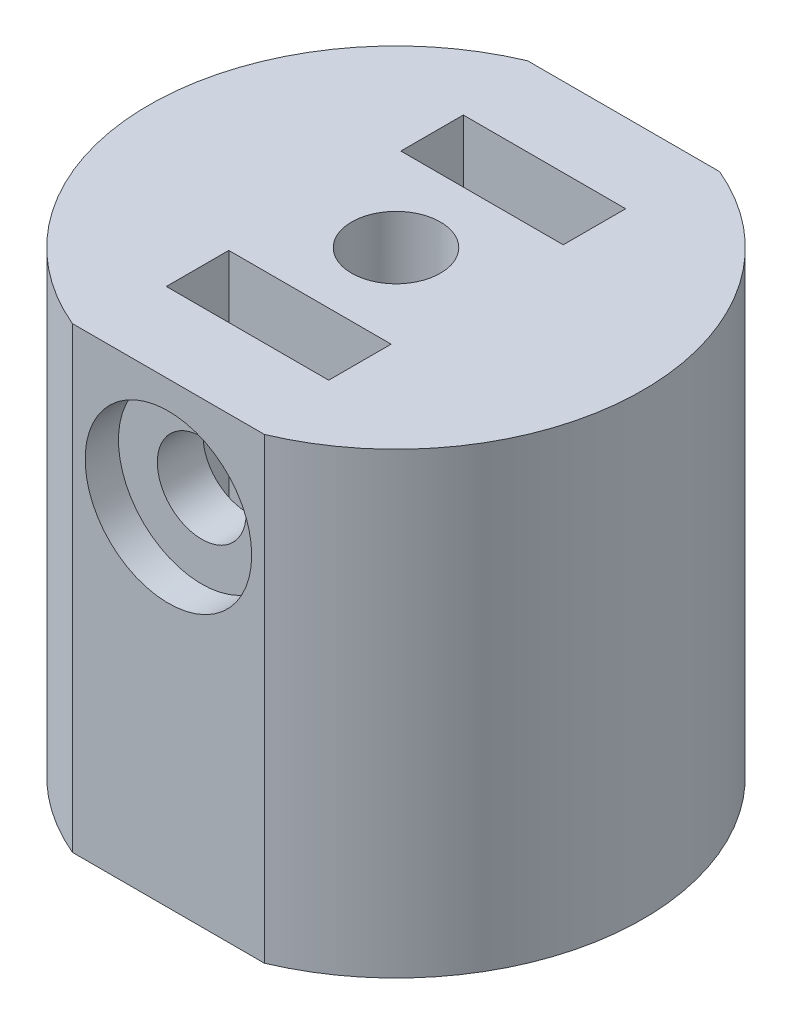
ISO-10303-21;
HEADER;
FILE_DESCRIPTION(('STEP AP214'),'2;1');
FILE_NAME('part.step','',(''),(''),'','','');
FILE_SCHEMA(('AUTOMOTIVE_DESIGN { 1 0 10303 214 1 1 1 1 }'));
ENDSEC;
DATA;
#1=APPLICATION_CONTEXT('core data for automotive mechanical design processes');
#2=APPLICATION_PROTOCOL_DEFINITION('international standard','automotive_design',2000,#1);
#3=PRODUCT_CONTEXT('',#1,'mechanical');
#4=PRODUCT('Part','Part','',(#3));
#5=PRODUCT_RELATED_PRODUCT_CATEGORY('part','',(#4));
#6=PRODUCT_DEFINITION_FORMATION('','',#4);
#7=PRODUCT_DEFINITION_CONTEXT('part definition',#1,'design');
#8=PRODUCT_DEFINITION('design','',#6,#7);
#9=PRODUCT_DEFINITION_SHAPE('','',#8);
#10=(LENGTH_UNIT() NAMED_UNIT(*) SI_UNIT(.MILLI.,.METRE.));
#11=(NAMED_UNIT(*) PLANE_ANGLE_UNIT() SI_UNIT($,.RADIAN.));
#12=(NAMED_UNIT(*) SI_UNIT($,.STERADIAN.) SOLID_ANGLE_UNIT());
#13=UNCERTAINTY_MEASURE_WITH_UNIT(LENGTH_MEASURE(1.E-05),#10,'distance_accuracy_value','');
#14=(GEOMETRIC_REPRESENTATION_CONTEXT(3) GLOBAL_UNCERTAINTY_ASSIGNED_CONTEXT((#13)) GLOBAL_UNIT_ASSIGNED_CONTEXT((#10,
#11,#12)) REPRESENTATION_CONTEXT('',''));
#15=CARTESIAN_POINT('',(0.,0.,0.));
#16=DIRECTION('',(0.,0.,1.));
#17=DIRECTION('',(1.,0.,0.));
#18=AXIS2_PLACEMENT_3D('',#15,#16,#17);
#19=CARTESIAN_POINT('',(0.,12.5,-8.2));
#20=DIRECTION('',(0.,0.,1.));
#21=DIRECTION('',(1.,0.,0.));
#22=AXIS2_PLACEMENT_3D('',#19,#20,#21);
#23=CYLINDRICAL_SURFACE('',#22,1.6);
#24=CARTESIAN_POINT('',(0.,12.5,-5.35));
#25=DIRECTION('',(0.,0.,1.));
#26=DIRECTION('',(1.,0.,0.));
#27=AXIS2_PLACEMENT_3D('',#24,#25,#26);
#28=CIRCLE('',#27,1.6);
#29=CARTESIAN_POINT('',(1.6,12.5,-5.35));
#30=VERTEX_POINT('',#29);
#31=EDGE_CURVE('E161',#30,#30,#28,.T.);
#32=ORIENTED_EDGE('',*,*,#31,.T.);
#33=EDGE_LOOP('',(#32));
#34=FACE_BOUND('',#33,.T.);
#35=CARTESIAN_POINT('',(0.,12.5,-7.));
#36=DIRECTION('',(0.,0.,-1.));
#37=DIRECTION('',(-1.,0.,0.));
#38=AXIS2_PLACEMENT_3D('',#35,#36,#37);
#39=CIRCLE('',#38,1.6);
#40=CARTESIAN_POINT('',(-1.6,12.5,-7.));
#41=VERTEX_POINT('',#40);
#42=EDGE_CURVE('E36',#41,#41,#39,.F.);
#43=ORIENTED_EDGE('',*,*,#42,.F.);
#44=EDGE_LOOP('',(#43));
#45=FACE_BOUND('',#44,.T.);
#46=ADVANCED_FACE('F32',(#34,#45),#23,.F.);
#47=CARTESIAN_POINT('',(0.,10.,0.));
#48=DIRECTION('',(0.,1.,0.));
#49=DIRECTION('',(0.,0.,1.));
#50=AXIS2_PLACEMENT_3D('',#47,#48,#49);
#51=CYLINDRICAL_SURFACE('',#50,1.6);
#52=CARTESIAN_POINT('',(0.,16.5,0.));
#53=DIRECTION('',(0.,1.,0.));
#54=DIRECTION('',(0.,0.,1.));
#55=AXIS2_PLACEMENT_3D('',#52,#53,#54);
#56=CIRCLE('',#55,1.6);
#57=CARTESIAN_POINT('',(0.,16.5,1.6));
#58=VERTEX_POINT('',#57);
#59=EDGE_CURVE('E207',#58,#58,#56,.T.);
#60=ORIENTED_EDGE('',*,*,#59,.T.);
#61=EDGE_LOOP('',(#60));
#62=FACE_BOUND('',#61,.T.);
#63=CARTESIAN_POINT('',(0.,12.5,0.));
#64=DIRECTION('',(0.,0.707106781186547,-0.707106781186548));
#65=DIRECTION('',(0.,0.707106781186547,0.707106781186548));
#66=AXIS2_PLACEMENT_3D('',#63,#64,#65);
#67=ELLIPSE('',#66,2.26274169979695,1.6);
#68=CARTESIAN_POINT('',(-1.6,12.5,0.));
#69=VERTEX_POINT('',#68);
#70=CARTESIAN_POINT('',(1.6,12.5,0.));
#71=VERTEX_POINT('',#70);
#72=EDGE_CURVE('E167',#69,#71,#67,.T.);
#73=ORIENTED_EDGE('',*,*,#72,.F.);
#74=CARTESIAN_POINT('',(0.,12.5,0.));
#75=DIRECTION('',(0.,0.707106781186547,0.707106781186548));
#76=DIRECTION('',(0.,0.707106781186547,-0.707106781186548));
#77=AXIS2_PLACEMENT_3D('',#74,#75,#76);
#78=ELLIPSE('',#77,2.26274169979695,1.6);
#79=EDGE_CURVE('E157',#69,#71,#78,.F.);
#80=ORIENTED_EDGE('',*,*,#79,.T.);
#81=EDGE_LOOP('',(#73,#80));
#82=FACE_BOUND('',#81,.T.);
#83=ADVANCED_FACE('F166',(#62,#82),#51,.F.);
#84=CARTESIAN_POINT('',(0.,16.5,0.));
#85=DIRECTION('',(0.,1.,0.));
#86=DIRECTION('',(0.,0.,1.));
#87=AXIS2_PLACEMENT_3D('',#84,#85,#86);
#88=PLANE('',#87);
#89=ORIENTED_EDGE('',*,*,#59,.F.);
#90=EDGE_LOOP('',(#89));
#91=FACE_BOUND('',#90,.T.);
#92=DIRECTION('',(0.,0.,1.));
#93=VECTOR('',#92,1.);
#94=CARTESIAN_POINT('',(-2.925,16.5,3.1));
#95=LINE('',#94,#93);
#96=CARTESIAN_POINT('',(-2.925,16.5,3.1));
#97=VERTEX_POINT('',#96);
#98=CARTESIAN_POINT('',(-2.925,16.5,5.35));
#99=VERTEX_POINT('',#98);
#100=EDGE_CURVE('E172',#97,#99,#95,.T.);
#101=ORIENTED_EDGE('',*,*,#100,.F.);
#102=DIRECTION('',(-1.,0.,0.));
#103=VECTOR('',#102,1.);
#104=CARTESIAN_POINT('',(-2.925,16.5,3.1));
#105=LINE('',#104,#103);
#106=CARTESIAN_POINT('',(2.925,16.5,3.1));
#107=VERTEX_POINT('',#106);
#108=EDGE_CURVE('E186',#107,#97,#105,.T.);
#109=ORIENTED_EDGE('',*,*,#108,.F.);
#110=DIRECTION('',(0.,0.,-1.));
#111=VECTOR('',#110,1.);
#112=CARTESIAN_POINT('',(2.925,16.5,3.1));
#113=LINE('',#112,#111);
#114=CARTESIAN_POINT('',(2.925,16.5,5.35));
#115=VERTEX_POINT('',#114);
#116=EDGE_CURVE('E200',#115,#107,#113,.T.);
#117=ORIENTED_EDGE('',*,*,#116,.F.);
#118=DIRECTION('',(1.,0.,0.));
#119=VECTOR('',#118,1.);
#120=CARTESIAN_POINT('',(-2.925,16.5,5.35));
#121=LINE('',#120,#119);
#122=EDGE_CURVE('E197',#99,#115,#121,.T.);
#123=ORIENTED_EDGE('',*,*,#122,.F.);
#124=EDGE_LOOP('',(#101,#109,#117,#123));
#125=FACE_BOUND('',#124,.T.);
#126=DIRECTION('',(-1.,0.,0.));
#127=VECTOR('',#126,1.);
#128=CARTESIAN_POINT('',(3.45976877840124,16.5,-8.2));
#129=LINE('',#128,#127);
#130=CARTESIAN_POINT('',(3.45976877840124,16.5,-8.2));
#131=VERTEX_POINT('',#130);
#132=CARTESIAN_POINT('',(-3.45976877840124,16.5,-8.2));
#133=VERTEX_POINT('',#132);
#134=EDGE_CURVE('E311',#131,#133,#129,.T.);
#135=ORIENTED_EDGE('',*,*,#134,.T.);
#136=CARTESIAN_POINT('',(0.,16.5,0.));
#137=DIRECTION('',(0.,1.,0.));
#138=DIRECTION('',(0.,0.,1.));
#139=AXIS2_PLACEMENT_3D('',#136,#137,#138);
#140=CIRCLE('',#139,8.9);
#141=CARTESIAN_POINT('',(-3.45976877840124,16.5,8.2));
#142=VERTEX_POINT('',#141);
#143=EDGE_CURVE('E256',#133,#142,#140,.T.);
#144=ORIENTED_EDGE('',*,*,#143,.T.);
#145=DIRECTION('',(1.,0.,0.));
#146=VECTOR('',#145,1.);
#147=CARTESIAN_POINT('',(-3.45976877840124,16.5,8.2));
#148=LINE('',#147,#146);
#149=CARTESIAN_POINT('',(3.45976877840124,16.5,8.2));
#150=VERTEX_POINT('',#149);
#151=EDGE_CURVE('E323',#142,#150,#148,.T.);
#152=ORIENTED_EDGE('',*,*,#151,.T.);
#153=CARTESIAN_POINT('',(0.,16.5,0.));
#154=DIRECTION('',(0.,1.,0.));
#155=DIRECTION('',(0.,0.,1.));
#156=AXIS2_PLACEMENT_3D('',#153,#154,#155);
#157=CIRCLE('',#156,8.9);
#158=EDGE_CURVE('E57',#150,#131,#157,.T.);
#159=ORIENTED_EDGE('',*,*,#158,.T.);
#160=EDGE_LOOP('',(#135,#144,#152,#159));
#161=FACE_BOUND('',#160,.T.);
#162=DIRECTION('',(-1.,0.,0.));
#163=VECTOR('',#162,1.);
#164=CARTESIAN_POINT('',(-2.925,16.5,-3.1));
#165=LINE('',#164,#163);
#166=CARTESIAN_POINT('',(2.925,16.5,-3.1));
#167=VERTEX_POINT('',#166);
#168=CARTESIAN_POINT('',(-2.925,16.5,-3.1));
#169=VERTEX_POINT('',#168);
#170=EDGE_CURVE('E288',#167,#169,#165,.T.);
#171=ORIENTED_EDGE('',*,*,#170,.T.);
#172=DIRECTION('',(0.,0.,-1.));
#173=VECTOR('',#172,1.);
#174=CARTESIAN_POINT('',(-2.925,16.5,-3.1));
#175=LINE('',#174,#173);
#176=CARTESIAN_POINT('',(-2.925,16.5,-5.35));
#177=VERTEX_POINT('',#176);
#178=EDGE_CURVE('E49',#169,#177,#175,.T.);
#179=ORIENTED_EDGE('',*,*,#178,.T.);
#180=DIRECTION('',(1.,0.,0.));
#181=VECTOR('',#180,1.);
#182=CARTESIAN_POINT('',(-2.925,16.5,-5.35));
#183=LINE('',#182,#181);
#184=CARTESIAN_POINT('',(2.925,16.5,-5.35));
#185=VERTEX_POINT('',#184);
#186=EDGE_CURVE('E280',#177,#185,#183,.T.);
#187=ORIENTED_EDGE('',*,*,#186,.T.);
#188=DIRECTION('',(0.,0.,1.));
#189=VECTOR('',#188,1.);
#190=CARTESIAN_POINT('',(2.925,16.5,-3.1));
#191=LINE('',#190,#189);
#192=EDGE_CURVE('E291',#185,#167,#191,.T.);
#193=ORIENTED_EDGE('',*,*,#192,.T.);
#194=EDGE_LOOP('',(#171,#179,#187,#193));
#195=FACE_BOUND('',#194,.T.);
#196=ADVANCED_FACE('F343',(#91,#125,#161,#195),#88,.T.);
#197=CARTESIAN_POINT('',(0.,12.5,11.3));
#198=DIRECTION('',(0.,0.,-1.));
#199=DIRECTION('',(-1.,0.,0.));
#200=AXIS2_PLACEMENT_3D('',#197,#198,#199);
#201=CYLINDRICAL_SURFACE('',#200,1.6);
#202=CARTESIAN_POINT('',(0.,12.5,5.35));
#203=DIRECTION('',(0.,0.,1.));
#204=DIRECTION('',(1.,0.,0.));
#205=AXIS2_PLACEMENT_3D('',#202,#203,#204);
#206=CIRCLE('',#205,1.6);
#207=CARTESIAN_POINT('',(1.6,12.5,5.35));
#208=VERTEX_POINT('',#207);
#209=EDGE_CURVE('E178',#208,#208,#206,.F.);
#210=ORIENTED_EDGE('',*,*,#209,.T.);
#211=EDGE_LOOP('',(#210));
#212=FACE_BOUND('',#211,.T.);
#213=CARTESIAN_POINT('',(0.,12.5,7.));
#214=DIRECTION('',(0.,0.,1.));
#215=DIRECTION('',(1.,0.,0.));
#216=AXIS2_PLACEMENT_3D('',#213,#214,#215);
#217=CIRCLE('',#216,1.6);
#218=CARTESIAN_POINT('',(1.6,12.5,7.));
#219=VERTEX_POINT('',#218);
#220=EDGE_CURVE('E254',#219,#219,#217,.T.);
#221=ORIENTED_EDGE('',*,*,#220,.T.);
#222=EDGE_LOOP('',(#221));
#223=FACE_BOUND('',#222,.T.);
#224=ADVANCED_FACE('F481',(#212,#223),#201,.F.);
#225=CARTESIAN_POINT('',(0.,0.,0.));
#226=DIRECTION('',(0.,1.,0.));
#227=DIRECTION('',(0.,0.,1.));
#228=AXIS2_PLACEMENT_3D('',#225,#226,#227);
#229=PLANE('',#228);
#230=CARTESIAN_POINT('',(0.,0.,0.));
#231=DIRECTION('',(0.,-1.,0.));
#232=DIRECTION('',(0.,0.,-1.));
#233=AXIS2_PLACEMENT_3D('',#230,#231,#232);
#234=CIRCLE('',#233,4.7);
#235=CARTESIAN_POINT('',(0.,0.,-4.7));
#236=VERTEX_POINT('',#235);
#237=EDGE_CURVE('E41',#236,#236,#234,.T.);
#238=ORIENTED_EDGE('',*,*,#237,.F.);
#239=EDGE_LOOP('',(#238));
#240=FACE_BOUND('',#239,.T.);
#241=CARTESIAN_POINT('',(0.,0.,0.));
#242=DIRECTION('',(0.,1.,0.));
#243=DIRECTION('',(0.,0.,1.));
#244=AXIS2_PLACEMENT_3D('',#241,#242,#243);
#245=CIRCLE('',#244,8.9);
#246=CARTESIAN_POINT('',(-3.45976877840124,0.,-8.2));
#247=VERTEX_POINT('',#246);
#248=CARTESIAN_POINT('',(-3.45976877840124,0.,8.2));
#249=VERTEX_POINT('',#248);
#250=EDGE_CURVE('E308',#247,#249,#245,.T.);
#251=ORIENTED_EDGE('',*,*,#250,.F.);
#252=DIRECTION('',(-1.,0.,0.));
#253=VECTOR('',#252,1.);
#254=CARTESIAN_POINT('',(3.45976877840124,0.,-8.2));
#255=LINE('',#254,#253);
#256=CARTESIAN_POINT('',(3.45976877840124,0.,-8.2));
#257=VERTEX_POINT('',#256);
#258=EDGE_CURVE('E317',#257,#247,#255,.T.);
#259=ORIENTED_EDGE('',*,*,#258,.F.);
#260=CARTESIAN_POINT('',(0.,0.,0.));
#261=DIRECTION('',(0.,1.,0.));
#262=DIRECTION('',(0.,0.,1.));
#263=AXIS2_PLACEMENT_3D('',#260,#261,#262);
#264=CIRCLE('',#263,8.9);
#265=CARTESIAN_POINT('',(3.45976877840124,0.,8.2));
#266=VERTEX_POINT('',#265);
#267=EDGE_CURVE('E314',#266,#257,#264,.T.);
#268=ORIENTED_EDGE('',*,*,#267,.F.);
#269=DIRECTION('',(1.,0.,0.));
#270=VECTOR('',#269,1.);
#271=CARTESIAN_POINT('',(-3.45976877840124,0.,8.2));
#272=LINE('',#271,#270);
#273=EDGE_CURVE('E310',#249,#266,#272,.T.);
#274=ORIENTED_EDGE('',*,*,#273,.F.);
#275=EDGE_LOOP('',(#251,#259,#268,#274));
#276=FACE_BOUND('',#275,.T.);
#277=ADVANCED_FACE('F34',(#240,#276),#229,.F.);
#278=CARTESIAN_POINT('',(0.,10.5,0.));
#279=DIRECTION('',(0.,-1.,0.));
#280=DIRECTION('',(0.,0.,-1.));
#281=AXIS2_PLACEMENT_3D('',#278,#279,#280);
#282=CIRCLE('',#281,1.6);
#283=CARTESIAN_POINT('',(0.,10.5,-1.6));
#284=VERTEX_POINT('',#283);
#285=EDGE_CURVE('E216',#284,#284,#282,.T.);
#286=ORIENTED_EDGE('',*,*,#285,.T.);
#287=EDGE_LOOP('',(#286));
#288=FACE_BOUND('',#287,.T.);
#289=CARTESIAN_POINT('',(0.,12.5,0.));
#290=DIRECTION('',(0.,0.707106781186547,0.707106781186548));
#291=DIRECTION('',(0.,0.707106781186547,-0.707106781186548));
#292=AXIS2_PLACEMENT_3D('',#289,#290,#291);
#293=ELLIPSE('',#292,2.26274169979695,1.6);
#294=EDGE_CURVE('E171',#71,#69,#293,.F.);
#295=ORIENTED_EDGE('',*,*,#294,.F.);
#296=CARTESIAN_POINT('',(0.,12.5,0.));
#297=DIRECTION('',(0.,0.707106781186547,-0.707106781186548));
#298=DIRECTION('',(0.,0.707106781186547,0.707106781186548));
#299=AXIS2_PLACEMENT_3D('',#296,#297,#298);
#300=ELLIPSE('',#299,2.26274169979695,1.6);
#301=EDGE_CURVE('E154',#71,#69,#300,.T.);
#302=ORIENTED_EDGE('',*,*,#301,.T.);
#303=EDGE_LOOP('',(#295,#302));
#304=FACE_BOUND('',#303,.T.);
#305=ADVANCED_FACE('F174',(#288,#304),#51,.F.);
#306=CARTESIAN_POINT('',(0.,4.5,0.));
#307=DIRECTION('',(0.,-1.,0.));
#308=DIRECTION('',(0.,0.,-1.));
#309=AXIS2_PLACEMENT_3D('',#306,#307,#308);
#310=PLANE('',#309);
#311=CARTESIAN_POINT('',(0.,4.5,0.));
#312=DIRECTION('',(0.,-1.,0.));
#313=DIRECTION('',(0.,0.,-1.));
#314=AXIS2_PLACEMENT_3D('',#311,#312,#313);
#315=CIRCLE('',#314,2.6);
#316=CARTESIAN_POINT('',(2.00935312974101,4.5,1.65));
#317=VERTEX_POINT('',#316);
#318=CARTESIAN_POINT('',(-2.00935312974101,4.5,1.65));
#319=VERTEX_POINT('',#318);
#320=EDGE_CURVE('E244',#317,#319,#315,.T.);
#321=ORIENTED_EDGE('',*,*,#320,.T.);
#322=DIRECTION('',(1.,0.,0.));
#323=VECTOR('',#322,1.);
#324=CARTESIAN_POINT('',(0.,4.5,1.65));
#325=LINE('',#324,#323);
#326=EDGE_CURVE('E221',#319,#317,#325,.T.);
#327=ORIENTED_EDGE('',*,*,#326,.T.);
#328=EDGE_LOOP('',(#321,#327));
#329=FACE_BOUND('',#328,.T.);
#330=ADVANCED_FACE('F491',(#329),#310,.T.);
#331=CARTESIAN_POINT('',(0.,1.5,0.));
#332=DIRECTION('',(0.,-1.,0.));
#333=DIRECTION('',(0.,0.,-1.));
#334=AXIS2_PLACEMENT_3D('',#331,#332,#333);
#335=CYLINDRICAL_SURFACE('',#334,4.7);
#336=CARTESIAN_POINT('',(0.,1.5,0.));
#337=DIRECTION('',(0.,-1.,0.));
#338=DIRECTION('',(0.,0.,-1.));
#339=AXIS2_PLACEMENT_3D('',#336,#337,#338);
#340=CIRCLE('',#339,4.7);
#341=CARTESIAN_POINT('',(0.,1.5,-4.7));
#342=VERTEX_POINT('',#341);
#343=EDGE_CURVE('E11',#342,#342,#340,.T.);
#344=ORIENTED_EDGE('',*,*,#343,.F.);
#345=EDGE_LOOP('',(#344));
#346=FACE_BOUND('',#345,.T.);
#347=ORIENTED_EDGE('',*,*,#237,.T.);
#348=EDGE_LOOP('',(#347));
#349=FACE_BOUND('',#348,.T.);
#350=ADVANCED_FACE('F545',(#346,#349),#335,.F.);
#351=CARTESIAN_POINT('',(0.,1.5,0.));
#352=DIRECTION('',(0.,-1.,0.));
#353=DIRECTION('',(0.,0.,-1.));
#354=AXIS2_PLACEMENT_3D('',#351,#352,#353);
#355=PLANE('',#354);
#356=CARTESIAN_POINT('',(0.,1.5,0.));
#357=DIRECTION('',(0.,-1.,0.));
#358=DIRECTION('',(0.,0.,-1.));
#359=AXIS2_PLACEMENT_3D('',#356,#357,#358);
#360=CIRCLE('',#359,2.6);
#361=CARTESIAN_POINT('',(0.,1.5,-2.6));
#362=VERTEX_POINT('',#361);
#363=EDGE_CURVE('E235',#362,#362,#360,.T.);
#364=ORIENTED_EDGE('',*,*,#363,.F.);
#365=EDGE_LOOP('',(#364));
#366=FACE_BOUND('',#365,.T.);
#367=ORIENTED_EDGE('',*,*,#343,.T.);
#368=EDGE_LOOP('',(#367));
#369=FACE_BOUND('',#368,.T.);
#370=ADVANCED_FACE('F547',(#366,#369),#355,.T.);
#371=CARTESIAN_POINT('',(0.,4.5,0.));
#372=DIRECTION('',(0.,-1.,0.));
#373=DIRECTION('',(0.,0.,-1.));
#374=AXIS2_PLACEMENT_3D('',#371,#372,#373);
#375=CYLINDRICAL_SURFACE('',#374,2.6);
#376=ORIENTED_EDGE('',*,*,#320,.F.);
#377=DIRECTION('',(0.,-1.,0.));
#378=VECTOR('',#377,1.);
#379=CARTESIAN_POINT('',(2.00935312974101,10.5,1.65));
#380=LINE('',#379,#378);
#381=CARTESIAN_POINT('',(2.00935312974101,10.5,1.65));
#382=VERTEX_POINT('',#381);
#383=EDGE_CURVE('E236',#382,#317,#380,.T.);
#384=ORIENTED_EDGE('',*,*,#383,.F.);
#385=CARTESIAN_POINT('',(0.,10.5,0.));
#386=DIRECTION('',(0.,-1.,0.));
#387=DIRECTION('',(0.,0.,-1.));
#388=AXIS2_PLACEMENT_3D('',#385,#386,#387);
#389=CIRCLE('',#388,2.6);
#390=CARTESIAN_POINT('',(2.00935312974101,10.5,-1.65));
#391=VERTEX_POINT('',#390);
#392=EDGE_CURVE('E222',#391,#382,#389,.T.);
#393=ORIENTED_EDGE('',*,*,#392,.F.);
#394=DIRECTION('',(0.,-1.,0.));
#395=VECTOR('',#394,1.);
#396=CARTESIAN_POINT('',(2.00935312974101,10.5,-1.65));
#397=LINE('',#396,#395);
#398=CARTESIAN_POINT('',(2.00935312974101,4.5,-1.65));
#399=VERTEX_POINT('',#398);
#400=EDGE_CURVE('E238',#391,#399,#397,.T.);
#401=ORIENTED_EDGE('',*,*,#400,.T.);
#402=CARTESIAN_POINT('',(-2.00935312974101,4.5,-1.65));
#403=VERTEX_POINT('',#402);
#404=EDGE_CURVE('E241',#403,#399,#315,.T.);
#405=ORIENTED_EDGE('',*,*,#404,.F.);
#406=DIRECTION('',(0.,-1.,0.));
#407=VECTOR('',#406,1.);
#408=CARTESIAN_POINT('',(-2.00935312974101,10.5,-1.65));
#409=LINE('',#408,#407);
#410=CARTESIAN_POINT('',(-2.00935312974101,10.5,-1.65));
#411=VERTEX_POINT('',#410);
#412=EDGE_CURVE('E227',#411,#403,#409,.T.);
#413=ORIENTED_EDGE('',*,*,#412,.F.);
#414=CARTESIAN_POINT('',(-2.00935312974101,10.5,1.65));
#415=VERTEX_POINT('',#414);
#416=EDGE_CURVE('E217',#415,#411,#389,.T.);
#417=ORIENTED_EDGE('',*,*,#416,.F.);
#418=DIRECTION('',(0.,-1.,0.));
#419=VECTOR('',#418,1.);
#420=CARTESIAN_POINT('',(-2.00935312974101,10.5,1.65));
#421=LINE('',#420,#419);
#422=EDGE_CURVE('E233',#415,#319,#421,.T.);
#423=ORIENTED_EDGE('',*,*,#422,.T.);
#424=EDGE_LOOP('',(#376,#384,#393,#401,#405,#413,#417,#423));
#425=FACE_BOUND('',#424,.T.);
#426=ORIENTED_EDGE('',*,*,#363,.T.);
#427=EDGE_LOOP('',(#426));
#428=FACE_BOUND('',#427,.T.);
#429=ADVANCED_FACE('F553',(#425,#428),#375,.F.);
#430=DIRECTION('',(1.,0.,0.));
#431=VECTOR('',#430,1.);
#432=CARTESIAN_POINT('',(0.,4.5,-1.65));
#433=LINE('',#432,#431);
#434=EDGE_CURVE('E228',#403,#399,#433,.T.);
#435=ORIENTED_EDGE('',*,*,#434,.F.);
#436=ORIENTED_EDGE('',*,*,#404,.T.);
#437=EDGE_LOOP('',(#435,#436));
#438=FACE_BOUND('',#437,.T.);
#439=ADVANCED_FACE('F558',(#438),#310,.T.);
#440=CARTESIAN_POINT('',(0.,10.5,1.65));
#441=DIRECTION('',(0.,0.,-1.));
#442=DIRECTION('',(-1.,0.,0.));
#443=AXIS2_PLACEMENT_3D('',#440,#441,#442);
#444=PLANE('',#443);
#445=ORIENTED_EDGE('',*,*,#326,.F.);
#446=ORIENTED_EDGE('',*,*,#422,.F.);
#447=DIRECTION('',(1.,0.,0.));
#448=VECTOR('',#447,1.);
#449=CARTESIAN_POINT('',(0.,10.5,1.65));
#450=LINE('',#449,#448);
#451=EDGE_CURVE('E225',#415,#382,#450,.T.);
#452=ORIENTED_EDGE('',*,*,#451,.T.);
#453=ORIENTED_EDGE('',*,*,#383,.T.);
#454=EDGE_LOOP('',(#445,#446,#452,#453));
#455=FACE_BOUND('',#454,.T.);
#456=ADVANCED_FACE('F565',(#455),#444,.T.);
#457=CARTESIAN_POINT('',(0.,10.5,-1.65));
#458=DIRECTION('',(0.,0.,-1.));
#459=DIRECTION('',(-1.,0.,0.));
#460=AXIS2_PLACEMENT_3D('',#457,#458,#459);
#461=PLANE('',#460);
#462=ORIENTED_EDGE('',*,*,#434,.T.);
#463=ORIENTED_EDGE('',*,*,#400,.F.);
#464=DIRECTION('',(1.,0.,0.));
#465=VECTOR('',#464,1.);
#466=CARTESIAN_POINT('',(0.,10.5,-1.65));
#467=LINE('',#466,#465);
#468=EDGE_CURVE('E220',#411,#391,#467,.T.);
#469=ORIENTED_EDGE('',*,*,#468,.F.);
#470=ORIENTED_EDGE('',*,*,#412,.T.);
#471=EDGE_LOOP('',(#462,#463,#469,#470));
#472=FACE_BOUND('',#471,.T.);
#473=ADVANCED_FACE('F567',(#472),#461,.F.);
#474=CARTESIAN_POINT('',(0.,10.5,0.));
#475=DIRECTION('',(0.,-1.,0.));
#476=DIRECTION('',(0.,0.,-1.));
#477=AXIS2_PLACEMENT_3D('',#474,#475,#476);
#478=PLANE('',#477);
#479=ORIENTED_EDGE('',*,*,#285,.F.);
#480=EDGE_LOOP('',(#479));
#481=FACE_BOUND('',#480,.T.);
#482=ORIENTED_EDGE('',*,*,#416,.T.);
#483=ORIENTED_EDGE('',*,*,#468,.T.);
#484=ORIENTED_EDGE('',*,*,#392,.T.);
#485=ORIENTED_EDGE('',*,*,#451,.F.);
#486=EDGE_LOOP('',(#482,#483,#484,#485));
#487=FACE_BOUND('',#486,.T.);
#488=ADVANCED_FACE('F570',(#481,#487),#478,.T.);
#489=CARTESIAN_POINT('',(-2.925,8.5,3.1));
#490=DIRECTION('',(-1.,0.,0.));
#491=DIRECTION('',(0.,0.,1.));
#492=AXIS2_PLACEMENT_3D('',#489,#490,#491);
#493=PLANE('',#492);
#494=ORIENTED_EDGE('',*,*,#100,.T.);
#495=DIRECTION('',(0.,1.,0.));
#496=VECTOR('',#495,1.);
#497=CARTESIAN_POINT('',(-2.925,8.5,5.35));
#498=LINE('',#497,#496);
#499=CARTESIAN_POINT('',(-2.925,8.5,5.35));
#500=VERTEX_POINT('',#499);
#501=EDGE_CURVE('E195',#500,#99,#498,.T.);
#502=ORIENTED_EDGE('',*,*,#501,.F.);
#503=DIRECTION('',(0.,0.,1.));
#504=VECTOR('',#503,1.);
#505=CARTESIAN_POINT('',(-2.925,8.5,3.1));
#506=LINE('',#505,#504);
#507=CARTESIAN_POINT('',(-2.925,8.5,3.1));
#508=VERTEX_POINT('',#507);
#509=EDGE_CURVE('E182',#508,#500,#506,.T.);
#510=ORIENTED_EDGE('',*,*,#509,.F.);
#511=DIRECTION('',(0.,1.,0.));
#512=VECTOR('',#511,1.);
#513=CARTESIAN_POINT('',(-2.925,8.5,3.1));
#514=LINE('',#513,#512);
#515=EDGE_CURVE('E205',#508,#97,#514,.T.);
#516=ORIENTED_EDGE('',*,*,#515,.T.);
#517=EDGE_LOOP('',(#494,#502,#510,#516));
#518=FACE_BOUND('',#517,.T.);
#519=ADVANCED_FACE('F576',(#518),#493,.F.);
#520=CARTESIAN_POINT('',(-2.925,8.5,3.1));
#521=DIRECTION('',(0.,0.,-1.));
#522=DIRECTION('',(-1.,0.,0.));
#523=AXIS2_PLACEMENT_3D('',#520,#521,#522);
#524=PLANE('',#523);
#525=CARTESIAN_POINT('',(0.,12.5,3.1));
#526=DIRECTION('',(0.,0.,-1.));
#527=DIRECTION('',(-1.,0.,0.));
#528=AXIS2_PLACEMENT_3D('',#525,#526,#527);
#529=CIRCLE('',#528,1.6);
#530=CARTESIAN_POINT('',(-1.6,12.5,3.1));
#531=VERTEX_POINT('',#530);
#532=EDGE_CURVE('E175',#531,#531,#529,.F.);
#533=ORIENTED_EDGE('',*,*,#532,.F.);
#534=EDGE_LOOP('',(#533));
#535=FACE_BOUND('',#534,.T.);
#536=ORIENTED_EDGE('',*,*,#108,.T.);
#537=ORIENTED_EDGE('',*,*,#515,.F.);
#538=DIRECTION('',(-1.,0.,0.));
#539=VECTOR('',#538,1.);
#540=CARTESIAN_POINT('',(-2.925,8.5,3.1));
#541=LINE('',#540,#539);
#542=CARTESIAN_POINT('',(2.925,8.5,3.1));
#543=VERTEX_POINT('',#542);
#544=EDGE_CURVE('E192',#543,#508,#541,.T.);
#545=ORIENTED_EDGE('',*,*,#544,.F.);
#546=DIRECTION('',(0.,1.,0.));
#547=VECTOR('',#546,1.);
#548=CARTESIAN_POINT('',(2.925,8.5,3.1));
#549=LINE('',#548,#547);
#550=EDGE_CURVE('E208',#543,#107,#549,.T.);
#551=ORIENTED_EDGE('',*,*,#550,.T.);
#552=EDGE_LOOP('',(#536,#537,#545,#551));
#553=FACE_BOUND('',#552,.T.);
#554=ADVANCED_FACE('F581',(#535,#553),#524,.F.);
#555=CARTESIAN_POINT('',(2.925,8.5,3.1));
#556=DIRECTION('',(1.,0.,0.));
#557=DIRECTION('',(0.,0.,-1.));
#558=AXIS2_PLACEMENT_3D('',#555,#556,#557);
#559=PLANE('',#558);
#560=ORIENTED_EDGE('',*,*,#116,.T.);
#561=ORIENTED_EDGE('',*,*,#550,.F.);
#562=DIRECTION('',(0.,0.,-1.));
#563=VECTOR('',#562,1.);
#564=CARTESIAN_POINT('',(2.925,8.5,3.1));
#565=LINE('',#564,#563);
#566=CARTESIAN_POINT('',(2.925,8.5,5.35));
#567=VERTEX_POINT('',#566);
#568=EDGE_CURVE('E189',#567,#543,#565,.T.);
#569=ORIENTED_EDGE('',*,*,#568,.F.);
#570=DIRECTION('',(0.,1.,0.));
#571=VECTOR('',#570,1.);
#572=CARTESIAN_POINT('',(2.925,8.5,5.35));
#573=LINE('',#572,#571);
#574=EDGE_CURVE('E210',#567,#115,#573,.T.);
#575=ORIENTED_EDGE('',*,*,#574,.T.);
#576=EDGE_LOOP('',(#560,#561,#569,#575));
#577=FACE_BOUND('',#576,.T.);
#578=ADVANCED_FACE('F586',(#577),#559,.F.);
#579=CARTESIAN_POINT('',(-2.925,8.5,5.35));
#580=DIRECTION('',(0.,0.,1.));
#581=DIRECTION('',(1.,0.,0.));
#582=AXIS2_PLACEMENT_3D('',#579,#580,#581);
#583=PLANE('',#582);
#584=ORIENTED_EDGE('',*,*,#209,.F.);
#585=EDGE_LOOP('',(#584));
#586=FACE_BOUND('',#585,.T.);
#587=ORIENTED_EDGE('',*,*,#122,.T.);
#588=ORIENTED_EDGE('',*,*,#574,.F.);
#589=DIRECTION('',(1.,0.,0.));
#590=VECTOR('',#589,1.);
#591=CARTESIAN_POINT('',(-2.925,8.5,5.35));
#592=LINE('',#591,#590);
#593=EDGE_CURVE('E185',#500,#567,#592,.T.);
#594=ORIENTED_EDGE('',*,*,#593,.F.);
#595=ORIENTED_EDGE('',*,*,#501,.T.);
#596=EDGE_LOOP('',(#587,#588,#594,#595));
#597=FACE_BOUND('',#596,.T.);
#598=ADVANCED_FACE('F583',(#586,#597),#583,.F.);
#599=CARTESIAN_POINT('',(0.,8.5,0.));
#600=DIRECTION('',(0.,1.,0.));
#601=DIRECTION('',(0.,0.,1.));
#602=AXIS2_PLACEMENT_3D('',#599,#600,#601);
#603=PLANE('',#602);
#604=ORIENTED_EDGE('',*,*,#509,.T.);
#605=ORIENTED_EDGE('',*,*,#593,.T.);
#606=ORIENTED_EDGE('',*,*,#568,.T.);
#607=ORIENTED_EDGE('',*,*,#544,.T.);
#608=EDGE_LOOP('',(#604,#605,#606,#607));
#609=FACE_BOUND('',#608,.T.);
#610=ADVANCED_FACE('F502',(#609),#603,.T.);
#611=ORIENTED_EDGE('',*,*,#532,.T.);
#612=EDGE_LOOP('',(#611));
#613=FACE_BOUND('',#612,.T.);
#614=ORIENTED_EDGE('',*,*,#72,.T.);
#615=ORIENTED_EDGE('',*,*,#294,.T.);
#616=EDGE_LOOP('',(#614,#615));
#617=FACE_BOUND('',#616,.T.);
#618=ADVANCED_FACE('F170',(#613,#617),#201,.F.);
#619=CARTESIAN_POINT('',(0.,0.,0.));
#620=DIRECTION('',(0.,1.,0.));
#621=DIRECTION('',(0.,0.,1.));
#622=AXIS2_PLACEMENT_3D('',#619,#620,#621);
#623=CYLINDRICAL_SURFACE('',#622,8.9);
#624=ORIENTED_EDGE('',*,*,#143,.F.);
#625=DIRECTION('',(0.,1.,0.));
#626=VECTOR('',#625,1.);
#627=CARTESIAN_POINT('',(-3.45976877840124,0.,-8.2));
#628=LINE('',#627,#626);
#629=EDGE_CURVE('E253',#247,#133,#628,.T.);
#630=ORIENTED_EDGE('',*,*,#629,.F.);
#631=ORIENTED_EDGE('',*,*,#250,.T.);
#632=DIRECTION('',(0.,1.,0.));
#633=VECTOR('',#632,1.);
#634=CARTESIAN_POINT('',(-3.45976877840124,0.,8.2));
#635=LINE('',#634,#633);
#636=EDGE_CURVE('E320',#249,#142,#635,.T.);
#637=ORIENTED_EDGE('',*,*,#636,.T.);
#638=EDGE_LOOP('',(#624,#630,#631,#637));
#639=FACE_BOUND('',#638,.T.);
#640=ADVANCED_FACE('F337',(#639),#623,.T.);
#641=CARTESIAN_POINT('',(3.45976877840124,0.,-8.2));
#642=DIRECTION('',(0.,0.,-1.));
#643=DIRECTION('',(-1.,0.,0.));
#644=AXIS2_PLACEMENT_3D('',#641,#642,#643);
#645=PLANE('',#644);
#646=CARTESIAN_POINT('',(0.,12.5,-8.2));
#647=DIRECTION('',(0.,0.,1.));
#648=DIRECTION('',(1.,0.,0.));
#649=AXIS2_PLACEMENT_3D('',#646,#647,#648);
#650=CIRCLE('',#649,3.);
#651=CARTESIAN_POINT('',(3.,12.5,-8.2));
#652=VERTEX_POINT('',#651);
#653=EDGE_CURVE('E269',#652,#652,#650,.T.);
#654=ORIENTED_EDGE('',*,*,#653,.T.);
#655=EDGE_LOOP('',(#654));
#656=FACE_BOUND('',#655,.T.);
#657=ORIENTED_EDGE('',*,*,#134,.F.);
#658=DIRECTION('',(0.,1.,0.));
#659=VECTOR('',#658,1.);
#660=CARTESIAN_POINT('',(3.45976877840124,0.,-8.2));
#661=LINE('',#660,#659);
#662=EDGE_CURVE('E330',#257,#131,#661,.T.);
#663=ORIENTED_EDGE('',*,*,#662,.F.);
#664=ORIENTED_EDGE('',*,*,#258,.T.);
#665=ORIENTED_EDGE('',*,*,#629,.T.);
#666=EDGE_LOOP('',(#657,#663,#664,#665));
#667=FACE_BOUND('',#666,.T.);
#668=ADVANCED_FACE('F347',(#656,#667),#645,.T.);
#669=CARTESIAN_POINT('',(0.,0.,0.));
#670=DIRECTION('',(0.,1.,0.));
#671=DIRECTION('',(0.,0.,1.));
#672=AXIS2_PLACEMENT_3D('',#669,#670,#671);
#673=CYLINDRICAL_SURFACE('',#672,8.9);
#674=ORIENTED_EDGE('',*,*,#158,.F.);
#675=DIRECTION('',(0.,1.,0.));
#676=VECTOR('',#675,1.);
#677=CARTESIAN_POINT('',(3.45976877840124,0.,8.2));
#678=LINE('',#677,#676);
#679=EDGE_CURVE('E332',#266,#150,#678,.T.);
#680=ORIENTED_EDGE('',*,*,#679,.F.);
#681=ORIENTED_EDGE('',*,*,#267,.T.);
#682=ORIENTED_EDGE('',*,*,#662,.T.);
#683=EDGE_LOOP('',(#674,#680,#681,#682));
#684=FACE_BOUND('',#683,.T.);
#685=ADVANCED_FACE('F351',(#684),#673,.T.);
#686=CARTESIAN_POINT('',(-3.45976877840124,0.,8.2));
#687=DIRECTION('',(0.,0.,1.));
#688=DIRECTION('',(1.,0.,0.));
#689=AXIS2_PLACEMENT_3D('',#686,#687,#688);
#690=PLANE('',#689);
#691=CARTESIAN_POINT('',(0.,12.5,8.2));
#692=DIRECTION('',(0.,0.,1.));
#693=DIRECTION('',(1.,0.,0.));
#694=AXIS2_PLACEMENT_3D('',#691,#692,#693);
#695=CIRCLE('',#694,3.);
#696=CARTESIAN_POINT('',(3.,12.5,8.2));
#697=VERTEX_POINT('',#696);
#698=EDGE_CURVE('E298',#697,#697,#695,.T.);
#699=ORIENTED_EDGE('',*,*,#698,.F.);
#700=EDGE_LOOP('',(#699));
#701=FACE_BOUND('',#700,.T.);
#702=ORIENTED_EDGE('',*,*,#151,.F.);
#703=ORIENTED_EDGE('',*,*,#636,.F.);
#704=ORIENTED_EDGE('',*,*,#273,.T.);
#705=ORIENTED_EDGE('',*,*,#679,.T.);
#706=EDGE_LOOP('',(#702,#703,#704,#705));
#707=FACE_BOUND('',#706,.T.);
#708=ADVANCED_FACE('F341',(#701,#707),#690,.T.);
#709=CARTESIAN_POINT('',(0.,12.5,7.));
#710=DIRECTION('',(0.,0.,1.));
#711=DIRECTION('',(1.,0.,0.));
#712=AXIS2_PLACEMENT_3D('',#709,#710,#711);
#713=CYLINDRICAL_SURFACE('',#712,3.);
#714=CARTESIAN_POINT('',(0.,12.5,7.));
#715=DIRECTION('',(0.,0.,1.));
#716=DIRECTION('',(1.,0.,0.));
#717=AXIS2_PLACEMENT_3D('',#714,#715,#716);
#718=CIRCLE('',#717,3.);
#719=CARTESIAN_POINT('',(3.,12.5,7.));
#720=VERTEX_POINT('',#719);
#721=EDGE_CURVE('E257',#720,#720,#718,.T.);
#722=ORIENTED_EDGE('',*,*,#721,.F.);
#723=EDGE_LOOP('',(#722));
#724=FACE_BOUND('',#723,.T.);
#725=ORIENTED_EDGE('',*,*,#698,.T.);
#726=EDGE_LOOP('',(#725));
#727=FACE_BOUND('',#726,.T.);
#728=ADVANCED_FACE('F358',(#724,#727),#713,.F.);
#729=CARTESIAN_POINT('',(0.,12.5,7.));
#730=DIRECTION('',(0.,0.,1.));
#731=DIRECTION('',(1.,0.,0.));
#732=AXIS2_PLACEMENT_3D('',#729,#730,#731);
#733=PLANE('',#732);
#734=ORIENTED_EDGE('',*,*,#220,.F.);
#735=EDGE_LOOP('',(#734));
#736=FACE_BOUND('',#735,.T.);
#737=ORIENTED_EDGE('',*,*,#721,.T.);
#738=EDGE_LOOP('',(#737));
#739=FACE_BOUND('',#738,.T.);
#740=ADVANCED_FACE('F404',(#736,#739),#733,.T.);
#741=CARTESIAN_POINT('',(-2.925,8.5,-3.1));
#742=DIRECTION('',(1.,0.,0.));
#743=DIRECTION('',(0.,0.,-1.));
#744=AXIS2_PLACEMENT_3D('',#741,#742,#743);
#745=PLANE('',#744);
#746=ORIENTED_EDGE('',*,*,#178,.F.);
#747=DIRECTION('',(0.,1.,0.));
#748=VECTOR('',#747,1.);
#749=CARTESIAN_POINT('',(-2.925,8.5,-3.1));
#750=LINE('',#749,#748);
#751=CARTESIAN_POINT('',(-2.925,8.5,-3.1));
#752=VERTEX_POINT('',#751);
#753=EDGE_CURVE('E286',#752,#169,#750,.T.);
#754=ORIENTED_EDGE('',*,*,#753,.F.);
#755=DIRECTION('',(0.,0.,-1.));
#756=VECTOR('',#755,1.);
#757=CARTESIAN_POINT('',(-2.925,8.5,-3.1));
#758=LINE('',#757,#756);
#759=CARTESIAN_POINT('',(-2.925,8.5,-5.35));
#760=VERTEX_POINT('',#759);
#761=EDGE_CURVE('E276',#752,#760,#758,.T.);
#762=ORIENTED_EDGE('',*,*,#761,.T.);
#763=DIRECTION('',(0.,1.,0.));
#764=VECTOR('',#763,1.);
#765=CARTESIAN_POINT('',(-2.925,8.5,-5.35));
#766=LINE('',#765,#764);
#767=EDGE_CURVE('E296',#760,#177,#766,.T.);
#768=ORIENTED_EDGE('',*,*,#767,.T.);
#769=EDGE_LOOP('',(#746,#754,#762,#768));
#770=FACE_BOUND('',#769,.T.);
#771=ADVANCED_FACE('F397',(#770),#745,.T.);
#772=CARTESIAN_POINT('',(-2.925,8.5,-5.35));
#773=DIRECTION('',(0.,0.,1.));
#774=DIRECTION('',(1.,0.,0.));
#775=AXIS2_PLACEMENT_3D('',#772,#773,#774);
#776=PLANE('',#775);
#777=ORIENTED_EDGE('',*,*,#31,.F.);
#778=EDGE_LOOP('',(#777));
#779=FACE_BOUND('',#778,.T.);
#780=ORIENTED_EDGE('',*,*,#186,.F.);
#781=ORIENTED_EDGE('',*,*,#767,.F.);
#782=DIRECTION('',(1.,0.,0.));
#783=VECTOR('',#782,1.);
#784=CARTESIAN_POINT('',(-2.925,8.5,-5.35));
#785=LINE('',#784,#783);
#786=CARTESIAN_POINT('',(2.925,8.5,-5.35));
#787=VERTEX_POINT('',#786);
#788=EDGE_CURVE('E284',#760,#787,#785,.T.);
#789=ORIENTED_EDGE('',*,*,#788,.T.);
#790=DIRECTION('',(0.,1.,0.));
#791=VECTOR('',#790,1.);
#792=CARTESIAN_POINT('',(2.925,8.5,-5.35));
#793=LINE('',#792,#791);
#794=EDGE_CURVE('E299',#787,#185,#793,.T.);
#795=ORIENTED_EDGE('',*,*,#794,.T.);
#796=EDGE_LOOP('',(#780,#781,#789,#795));
#797=FACE_BOUND('',#796,.T.);
#798=ADVANCED_FACE('F394',(#779,#797),#776,.T.);
#799=CARTESIAN_POINT('',(2.925,8.5,-3.1));
#800=DIRECTION('',(-1.,0.,0.));
#801=DIRECTION('',(0.,0.,1.));
#802=AXIS2_PLACEMENT_3D('',#799,#800,#801);
#803=PLANE('',#802);
#804=ORIENTED_EDGE('',*,*,#192,.F.);
#805=ORIENTED_EDGE('',*,*,#794,.F.);
#806=DIRECTION('',(0.,0.,1.));
#807=VECTOR('',#806,1.);
#808=CARTESIAN_POINT('',(2.925,8.5,-3.1));
#809=LINE('',#808,#807);
#810=CARTESIAN_POINT('',(2.925,8.5,-3.1));
#811=VERTEX_POINT('',#810);
#812=EDGE_CURVE('E282',#787,#811,#809,.T.);
#813=ORIENTED_EDGE('',*,*,#812,.T.);
#814=DIRECTION('',(0.,1.,0.));
#815=VECTOR('',#814,1.);
#816=CARTESIAN_POINT('',(2.925,8.5,-3.1));
#817=LINE('',#816,#815);
#818=EDGE_CURVE('E301',#811,#167,#817,.T.);
#819=ORIENTED_EDGE('',*,*,#818,.T.);
#820=EDGE_LOOP('',(#804,#805,#813,#819));
#821=FACE_BOUND('',#820,.T.);
#822=ADVANCED_FACE('F389',(#821),#803,.T.);
#823=CARTESIAN_POINT('',(-2.925,8.5,-3.1));
#824=DIRECTION('',(0.,0.,-1.));
#825=DIRECTION('',(-1.,0.,0.));
#826=AXIS2_PLACEMENT_3D('',#823,#824,#825);
#827=PLANE('',#826);
#828=CARTESIAN_POINT('',(0.,12.5,-3.1));
#829=DIRECTION('',(0.,0.,-1.));
#830=DIRECTION('',(-1.,0.,0.));
#831=AXIS2_PLACEMENT_3D('',#828,#829,#830);
#832=CIRCLE('',#831,1.6);
#833=CARTESIAN_POINT('',(-1.6,12.5,-3.1));
#834=VERTEX_POINT('',#833);
#835=EDGE_CURVE('E258',#834,#834,#832,.T.);
#836=ORIENTED_EDGE('',*,*,#835,.F.);
#837=EDGE_LOOP('',(#836));
#838=FACE_BOUND('',#837,.T.);
#839=ORIENTED_EDGE('',*,*,#170,.F.);
#840=ORIENTED_EDGE('',*,*,#818,.F.);
#841=DIRECTION('',(-1.,0.,0.));
#842=VECTOR('',#841,1.);
#843=CARTESIAN_POINT('',(-2.925,8.5,-3.1));
#844=LINE('',#843,#842);
#845=EDGE_CURVE('E279',#811,#752,#844,.T.);
#846=ORIENTED_EDGE('',*,*,#845,.T.);
#847=ORIENTED_EDGE('',*,*,#753,.T.);
#848=EDGE_LOOP('',(#839,#840,#846,#847));
#849=FACE_BOUND('',#848,.T.);
#850=ADVANCED_FACE('F384',(#838,#849),#827,.T.);
#851=CARTESIAN_POINT('',(0.,8.5,0.));
#852=DIRECTION('',(0.,1.,0.));
#853=DIRECTION('',(0.,0.,-1.));
#854=AXIS2_PLACEMENT_3D('',#851,#852,#853);
#855=PLANE('',#854);
#856=ORIENTED_EDGE('',*,*,#761,.F.);
#857=ORIENTED_EDGE('',*,*,#845,.F.);
#858=ORIENTED_EDGE('',*,*,#812,.F.);
#859=ORIENTED_EDGE('',*,*,#788,.F.);
#860=EDGE_LOOP('',(#856,#857,#858,#859));
#861=FACE_BOUND('',#860,.T.);
#862=ADVANCED_FACE('F376',(#861),#855,.T.);
#863=ORIENTED_EDGE('',*,*,#835,.T.);
#864=EDGE_LOOP('',(#863));
#865=FACE_BOUND('',#864,.T.);
#866=ORIENTED_EDGE('',*,*,#301,.F.);
#867=ORIENTED_EDGE('',*,*,#79,.F.);
#868=EDGE_LOOP('',(#866,#867));
#869=FACE_BOUND('',#868,.T.);
#870=ADVANCED_FACE('F156',(#865,#869),#23,.F.);
#871=CARTESIAN_POINT('',(0.,12.5,-7.));
#872=DIRECTION('',(0.,0.,-1.));
#873=DIRECTION('',(1.,0.,0.));
#874=AXIS2_PLACEMENT_3D('',#871,#872,#873);
#875=PLANE('',#874);
#876=CARTESIAN_POINT('',(0.,12.5,-7.));
#877=DIRECTION('',(0.,0.,1.));
#878=DIRECTION('',(1.,0.,0.));
#879=AXIS2_PLACEMENT_3D('',#876,#877,#878);
#880=CIRCLE('',#879,3.);
#881=CARTESIAN_POINT('',(3.,12.5,-7.));
#882=VERTEX_POINT('',#881);
#883=EDGE_CURVE('E265',#882,#882,#880,.T.);
#884=ORIENTED_EDGE('',*,*,#883,.F.);
#885=EDGE_LOOP('',(#884));
#886=FACE_BOUND('',#885,.T.);
#887=ORIENTED_EDGE('',*,*,#42,.T.);
#888=EDGE_LOOP('',(#887));
#889=FACE_BOUND('',#888,.T.);
#890=ADVANCED_FACE('F375',(#886,#889),#875,.T.);
#891=CARTESIAN_POINT('',(0.,12.5,-7.));
#892=DIRECTION('',(0.,0.,-1.));
#893=DIRECTION('',(-1.,0.,0.));
#894=AXIS2_PLACEMENT_3D('',#891,#892,#893);
#895=CYLINDRICAL_SURFACE('',#894,3.);
#896=ORIENTED_EDGE('',*,*,#883,.T.);
#897=EDGE_LOOP('',(#896));
#898=FACE_BOUND('',#897,.T.);
#899=ORIENTED_EDGE('',*,*,#653,.F.);
#900=EDGE_LOOP('',(#899));
#901=FACE_BOUND('',#900,.T.);
#902=ADVANCED_FACE('F381',(#898,#901),#895,.F.);
#903=CLOSED_SHELL('',(#46,#83,#196,#224,#277,#305,#330,#350,#370,#429,#439,#456,#473,#488,#519,
#554,#578,#598,#610,#618,#640,#668,#685,#708,#728,#740,#771,#798,#822,#850,#862,#870,#890,#902));
#904=MANIFOLD_SOLID_BREP('B2',#903);
#905=ADVANCED_BREP_SHAPE_REPRESENTATION('',(#18,#904),#14);
#906=SHAPE_DEFINITION_REPRESENTATION(#9,#905);
ENDSEC;
END-ISO-10303-21;
